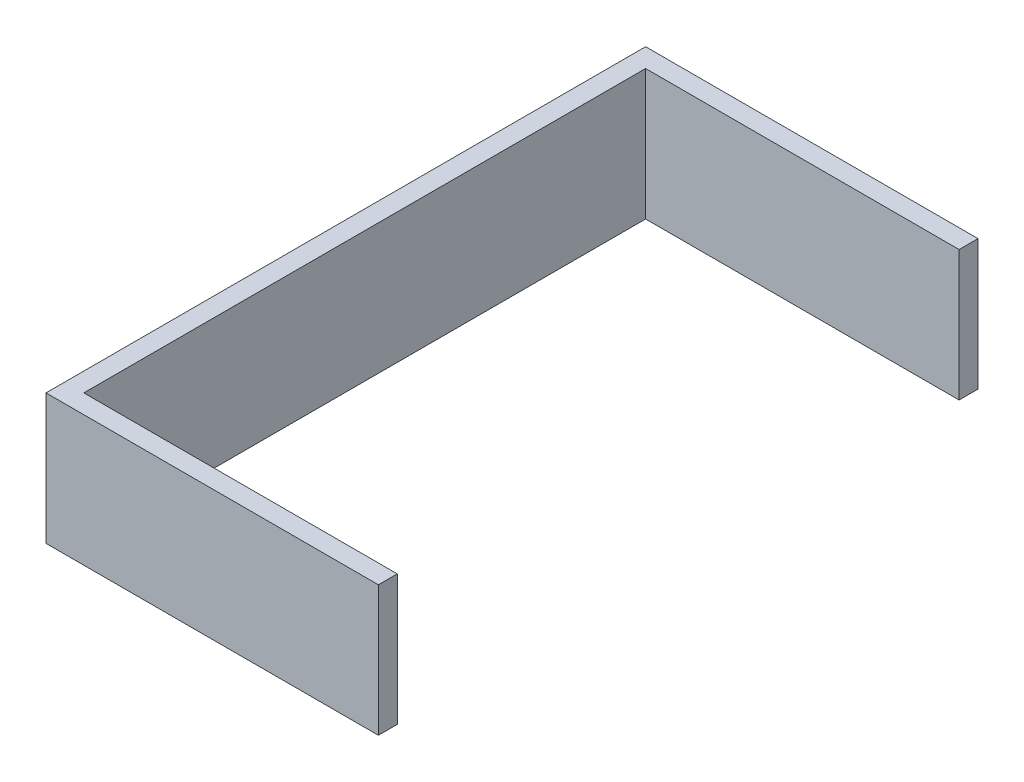
ISO-10303-21;
HEADER;
FILE_DESCRIPTION(('STEP AP214'),'2;1');
FILE_NAME('part.step','',(''),(''),'','','');
FILE_SCHEMA(('AUTOMOTIVE_DESIGN { 1 0 10303 214 1 1 1 1 }'));
ENDSEC;
DATA;
#1=APPLICATION_CONTEXT('core data for automotive mechanical design processes');
#2=APPLICATION_PROTOCOL_DEFINITION('international standard','automotive_design',2000,#1);
#3=PRODUCT_CONTEXT('',#1,'mechanical');
#4=PRODUCT('Part','Part','',(#3));
#5=PRODUCT_RELATED_PRODUCT_CATEGORY('part','',(#4));
#6=PRODUCT_DEFINITION_FORMATION('','',#4);
#7=PRODUCT_DEFINITION_CONTEXT('part definition',#1,'design');
#8=PRODUCT_DEFINITION('design','',#6,#7);
#9=PRODUCT_DEFINITION_SHAPE('','',#8);
#10=(LENGTH_UNIT() NAMED_UNIT(*) SI_UNIT(.MILLI.,.METRE.));
#11=(NAMED_UNIT(*) PLANE_ANGLE_UNIT() SI_UNIT($,.RADIAN.));
#12=(NAMED_UNIT(*) SI_UNIT($,.STERADIAN.) SOLID_ANGLE_UNIT());
#13=UNCERTAINTY_MEASURE_WITH_UNIT(LENGTH_MEASURE(1.E-05),#10,'distance_accuracy_value','');
#14=(GEOMETRIC_REPRESENTATION_CONTEXT(3) GLOBAL_UNCERTAINTY_ASSIGNED_CONTEXT((#13)) GLOBAL_UNIT_ASSIGNED_CONTEXT((#10,
#11,#12)) REPRESENTATION_CONTEXT('',''));
#15=CARTESIAN_POINT('',(0.,0.,0.));
#16=DIRECTION('',(0.,0.,1.));
#17=DIRECTION('',(1.,0.,0.));
#18=AXIS2_PLACEMENT_3D('',#15,#16,#17);
#19=CARTESIAN_POINT('',(323.85,127.,0.));
#20=DIRECTION('',(-1.,0.,0.));
#21=DIRECTION('',(0.,0.,1.));
#22=AXIS2_PLACEMENT_3D('',#19,#20,#21);
#23=PLANE('',#22);
#24=DIRECTION('',(0.,0.,-1.));
#25=VECTOR('',#24,1.);
#26=CARTESIAN_POINT('',(323.85,0.,0.));
#27=LINE('',#26,#25);
#28=CARTESIAN_POINT('',(323.85,0.,0.));
#29=VERTEX_POINT('',#28);
#30=CARTESIAN_POINT('',(323.85,0.,-18.415));
#31=VERTEX_POINT('',#30);
#32=EDGE_CURVE('E179',#29,#31,#27,.T.);
#33=ORIENTED_EDGE('',*,*,#32,.T.);
#34=DIRECTION('',(0.,-1.,0.));
#35=VECTOR('',#34,1.);
#36=CARTESIAN_POINT('',(323.85,127.,-18.415));
#37=LINE('',#36,#35);
#38=CARTESIAN_POINT('',(323.85,127.,-18.415));
#39=VERTEX_POINT('',#38);
#40=EDGE_CURVE('E75',#39,#31,#37,.T.);
#41=ORIENTED_EDGE('',*,*,#40,.F.);
#42=DIRECTION('',(0.,0.,-1.));
#43=VECTOR('',#42,1.);
#44=CARTESIAN_POINT('',(323.85,127.,0.));
#45=LINE('',#44,#43);
#46=CARTESIAN_POINT('',(323.85,127.,0.));
#47=VERTEX_POINT('',#46);
#48=EDGE_CURVE('E191',#47,#39,#45,.T.);
#49=ORIENTED_EDGE('',*,*,#48,.F.);
#50=DIRECTION('',(0.,-1.,0.));
#51=VECTOR('',#50,1.);
#52=CARTESIAN_POINT('',(323.85,127.,0.));
#53=LINE('',#52,#51);
#54=EDGE_CURVE('E12',#47,#29,#53,.T.);
#55=ORIENTED_EDGE('',*,*,#54,.T.);
#56=EDGE_LOOP('',(#33,#41,#49,#55));
#57=FACE_BOUND('',#56,.T.);
#58=ADVANCED_FACE('F65',(#57),#23,.F.);
#59=CARTESIAN_POINT('',(0.,127.,-18.415));
#60=DIRECTION('',(0.,0.,-1.));
#61=DIRECTION('',(-1.,0.,0.));
#62=AXIS2_PLACEMENT_3D('',#59,#60,#61);
#63=PLANE('',#62);
#64=DIRECTION('',(1.,0.,0.));
#65=VECTOR('',#64,1.);
#66=CARTESIAN_POINT('',(0.,0.,-18.415));
#67=LINE('',#66,#65);
#68=CARTESIAN_POINT('',(0.,0.,-18.415));
#69=VERTEX_POINT('',#68);
#70=EDGE_CURVE('E176',#69,#31,#67,.T.);
#71=ORIENTED_EDGE('',*,*,#70,.F.);
#72=DIRECTION('',(0.,-1.,0.));
#73=VECTOR('',#72,1.);
#74=CARTESIAN_POINT('',(0.,127.,-18.415));
#75=LINE('',#74,#73);
#76=CARTESIAN_POINT('',(0.,127.,-18.415));
#77=VERTEX_POINT('',#76);
#78=EDGE_CURVE('E168',#77,#69,#75,.T.);
#79=ORIENTED_EDGE('',*,*,#78,.F.);
#80=DIRECTION('',(1.,0.,0.));
#81=VECTOR('',#80,1.);
#82=CARTESIAN_POINT('',(0.,127.,-18.415));
#83=LINE('',#82,#81);
#84=EDGE_CURVE('E188',#77,#39,#83,.T.);
#85=ORIENTED_EDGE('',*,*,#84,.T.);
#86=ORIENTED_EDGE('',*,*,#40,.T.);
#87=EDGE_LOOP('',(#71,#79,#85,#86));
#88=FACE_BOUND('',#87,.T.);
#89=ADVANCED_FACE('F213',(#88),#63,.T.);
#90=CARTESIAN_POINT('',(0.,127.,0.));
#91=DIRECTION('',(0.,1.,0.));
#92=DIRECTION('',(0.,0.,1.));
#93=AXIS2_PLACEMENT_3D('',#90,#91,#92);
#94=PLANE('',#93);
#95=DIRECTION('',(1.,0.,0.));
#96=VECTOR('',#95,1.);
#97=CARTESIAN_POINT('',(0.,127.,0.));
#98=LINE('',#97,#96);
#99=CARTESIAN_POINT('',(18.415,127.,0.));
#100=VERTEX_POINT('',#99);
#101=EDGE_CURVE('E194',#100,#47,#98,.T.);
#102=ORIENTED_EDGE('',*,*,#101,.T.);
#103=ORIENTED_EDGE('',*,*,#48,.T.);
#104=ORIENTED_EDGE('',*,*,#84,.F.);
#105=DIRECTION('',(0.,0.,-1.));
#106=VECTOR('',#105,1.);
#107=CARTESIAN_POINT('',(0.,127.,0.));
#108=LINE('',#107,#106);
#109=CARTESIAN_POINT('',(0.,127.,565.785));
#110=VERTEX_POINT('',#109);
#111=EDGE_CURVE('E185',#110,#77,#108,.T.);
#112=ORIENTED_EDGE('',*,*,#111,.F.);
#113=DIRECTION('',(1.,0.,0.));
#114=VECTOR('',#113,1.);
#115=CARTESIAN_POINT('',(0.,127.,565.785));
#116=LINE('',#115,#114);
#117=CARTESIAN_POINT('',(323.85,127.,565.785));
#118=VERTEX_POINT('',#117);
#119=EDGE_CURVE('E138',#110,#118,#116,.T.);
#120=ORIENTED_EDGE('',*,*,#119,.T.);
#121=DIRECTION('',(0.,0.,1.));
#122=VECTOR('',#121,1.);
#123=CARTESIAN_POINT('',(323.85,127.,547.37));
#124=LINE('',#123,#122);
#125=CARTESIAN_POINT('',(323.85,127.,547.37));
#126=VERTEX_POINT('',#125);
#127=EDGE_CURVE('E159',#126,#118,#124,.T.);
#128=ORIENTED_EDGE('',*,*,#127,.F.);
#129=DIRECTION('',(1.,0.,0.));
#130=VECTOR('',#129,1.);
#131=CARTESIAN_POINT('',(0.,127.,547.37));
#132=LINE('',#131,#130);
#133=CARTESIAN_POINT('',(18.4150000000001,127.,547.37));
#134=VERTEX_POINT('',#133);
#135=EDGE_CURVE('E144',#134,#126,#132,.T.);
#136=ORIENTED_EDGE('',*,*,#135,.F.);
#137=DIRECTION('',(0.,0.,1.));
#138=VECTOR('',#137,1.);
#139=CARTESIAN_POINT('',(18.415,127.,0.));
#140=LINE('',#139,#138);
#141=EDGE_CURVE('E172',#100,#134,#140,.T.);
#142=ORIENTED_EDGE('',*,*,#141,.F.);
#143=EDGE_LOOP('',(#102,#103,#104,#112,#120,#128,#136,#142));
#144=FACE_BOUND('',#143,.T.);
#145=ADVANCED_FACE('F202',(#144),#94,.T.);
#146=CARTESIAN_POINT('',(0.,127.,0.));
#147=DIRECTION('',(0.,0.,-1.));
#148=DIRECTION('',(-1.,0.,0.));
#149=AXIS2_PLACEMENT_3D('',#146,#147,#148);
#150=PLANE('',#149);
#151=DIRECTION('',(1.,0.,0.));
#152=VECTOR('',#151,1.);
#153=CARTESIAN_POINT('',(0.,0.,0.));
#154=LINE('',#153,#152);
#155=CARTESIAN_POINT('',(18.415,0.,0.));
#156=VERTEX_POINT('',#155);
#157=EDGE_CURVE('E182',#156,#29,#154,.T.);
#158=ORIENTED_EDGE('',*,*,#157,.T.);
#159=ORIENTED_EDGE('',*,*,#54,.F.);
#160=ORIENTED_EDGE('',*,*,#101,.F.);
#161=DIRECTION('',(0.,-1.,0.));
#162=VECTOR('',#161,1.);
#163=CARTESIAN_POINT('',(18.415,127.,0.));
#164=LINE('',#163,#162);
#165=EDGE_CURVE('E84',#100,#156,#164,.T.);
#166=ORIENTED_EDGE('',*,*,#165,.T.);
#167=EDGE_LOOP('',(#158,#159,#160,#166));
#168=FACE_BOUND('',#167,.T.);
#169=ADVANCED_FACE('F219',(#168),#150,.F.);
#170=CARTESIAN_POINT('',(0.,0.,0.));
#171=DIRECTION('',(0.,1.,0.));
#172=DIRECTION('',(0.,0.,1.));
#173=AXIS2_PLACEMENT_3D('',#170,#171,#172);
#174=PLANE('',#173);
#175=ORIENTED_EDGE('',*,*,#157,.F.);
#176=DIRECTION('',(0.,0.,1.));
#177=VECTOR('',#176,1.);
#178=CARTESIAN_POINT('',(18.415,0.,0.));
#179=LINE('',#178,#177);
#180=CARTESIAN_POINT('',(18.4150000000001,0.,547.37));
#181=VERTEX_POINT('',#180);
#182=EDGE_CURVE('E136',#156,#181,#179,.T.);
#183=ORIENTED_EDGE('',*,*,#182,.T.);
#184=DIRECTION('',(1.,0.,0.));
#185=VECTOR('',#184,1.);
#186=CARTESIAN_POINT('',(0.,0.,547.37));
#187=LINE('',#186,#185);
#188=CARTESIAN_POINT('',(323.85,0.,547.37));
#189=VERTEX_POINT('',#188);
#190=EDGE_CURVE('E130',#181,#189,#187,.T.);
#191=ORIENTED_EDGE('',*,*,#190,.T.);
#192=DIRECTION('',(0.,0.,1.));
#193=VECTOR('',#192,1.);
#194=CARTESIAN_POINT('',(323.85,0.,547.37));
#195=LINE('',#194,#193);
#196=CARTESIAN_POINT('',(323.85,0.,565.785));
#197=VERTEX_POINT('',#196);
#198=EDGE_CURVE('E135',#189,#197,#195,.T.);
#199=ORIENTED_EDGE('',*,*,#198,.T.);
#200=DIRECTION('',(1.,0.,0.));
#201=VECTOR('',#200,1.);
#202=CARTESIAN_POINT('',(0.,0.,565.785));
#203=LINE('',#202,#201);
#204=CARTESIAN_POINT('',(0.,0.,565.785));
#205=VERTEX_POINT('',#204);
#206=EDGE_CURVE('E148',#205,#197,#203,.T.);
#207=ORIENTED_EDGE('',*,*,#206,.F.);
#208=DIRECTION('',(0.,0.,-1.));
#209=VECTOR('',#208,1.);
#210=CARTESIAN_POINT('',(0.,0.,0.));
#211=LINE('',#210,#209);
#212=EDGE_CURVE('E173',#205,#69,#211,.T.);
#213=ORIENTED_EDGE('',*,*,#212,.T.);
#214=ORIENTED_EDGE('',*,*,#70,.T.);
#215=ORIENTED_EDGE('',*,*,#32,.F.);
#216=EDGE_LOOP('',(#175,#183,#191,#199,#207,#213,#214,#215));
#217=FACE_BOUND('',#216,.T.);
#218=ADVANCED_FACE('F133',(#217),#174,.F.);
#219=CARTESIAN_POINT('',(18.415,127.,0.));
#220=DIRECTION('',(1.,0.,0.));
#221=DIRECTION('',(0.,0.,-1.));
#222=AXIS2_PLACEMENT_3D('',#219,#220,#221);
#223=PLANE('',#222);
#224=ORIENTED_EDGE('',*,*,#182,.F.);
#225=ORIENTED_EDGE('',*,*,#165,.F.);
#226=ORIENTED_EDGE('',*,*,#141,.T.);
#227=DIRECTION('',(0.,-1.,0.));
#228=VECTOR('',#227,1.);
#229=CARTESIAN_POINT('',(18.4150000000001,127.,547.37));
#230=LINE('',#229,#228);
#231=EDGE_CURVE('E160',#134,#181,#230,.T.);
#232=ORIENTED_EDGE('',*,*,#231,.T.);
#233=EDGE_LOOP('',(#224,#225,#226,#232));
#234=FACE_BOUND('',#233,.T.);
#235=ADVANCED_FACE('F201',(#234),#223,.T.);
#236=CARTESIAN_POINT('',(0.,127.,0.));
#237=DIRECTION('',(-1.,0.,0.));
#238=DIRECTION('',(0.,0.,1.));
#239=AXIS2_PLACEMENT_3D('',#236,#237,#238);
#240=PLANE('',#239);
#241=ORIENTED_EDGE('',*,*,#212,.F.);
#242=DIRECTION('',(0.,-1.,0.));
#243=VECTOR('',#242,1.);
#244=CARTESIAN_POINT('',(0.,127.,565.785));
#245=LINE('',#244,#243);
#246=EDGE_CURVE('E157',#110,#205,#245,.T.);
#247=ORIENTED_EDGE('',*,*,#246,.F.);
#248=ORIENTED_EDGE('',*,*,#111,.T.);
#249=ORIENTED_EDGE('',*,*,#78,.T.);
#250=EDGE_LOOP('',(#241,#247,#248,#249));
#251=FACE_BOUND('',#250,.T.);
#252=ADVANCED_FACE('F209',(#251),#240,.T.);
#253=CARTESIAN_POINT('',(0.,127.,565.785));
#254=DIRECTION('',(0.,0.,-1.));
#255=DIRECTION('',(-1.,0.,0.));
#256=AXIS2_PLACEMENT_3D('',#253,#254,#255);
#257=PLANE('',#256);
#258=ORIENTED_EDGE('',*,*,#206,.T.);
#259=DIRECTION('',(0.,-1.,0.));
#260=VECTOR('',#259,1.);
#261=CARTESIAN_POINT('',(323.85,127.,565.785));
#262=LINE('',#261,#260);
#263=EDGE_CURVE('E123',#118,#197,#262,.T.);
#264=ORIENTED_EDGE('',*,*,#263,.F.);
#265=ORIENTED_EDGE('',*,*,#119,.F.);
#266=ORIENTED_EDGE('',*,*,#246,.T.);
#267=EDGE_LOOP('',(#258,#264,#265,#266));
#268=FACE_BOUND('',#267,.T.);
#269=ADVANCED_FACE('F67',(#268),#257,.F.);
#270=CARTESIAN_POINT('',(323.85,127.,547.37));
#271=DIRECTION('',(1.,0.,0.));
#272=DIRECTION('',(0.,0.,-1.));
#273=AXIS2_PLACEMENT_3D('',#270,#271,#272);
#274=PLANE('',#273);
#275=ORIENTED_EDGE('',*,*,#198,.F.);
#276=DIRECTION('',(0.,-1.,0.));
#277=VECTOR('',#276,1.);
#278=CARTESIAN_POINT('',(323.85,127.,547.37));
#279=LINE('',#278,#277);
#280=EDGE_CURVE('E141',#126,#189,#279,.T.);
#281=ORIENTED_EDGE('',*,*,#280,.F.);
#282=ORIENTED_EDGE('',*,*,#127,.T.);
#283=ORIENTED_EDGE('',*,*,#263,.T.);
#284=EDGE_LOOP('',(#275,#281,#282,#283));
#285=FACE_BOUND('',#284,.T.);
#286=ADVANCED_FACE('F147',(#285),#274,.T.);
#287=CARTESIAN_POINT('',(0.,127.,547.37));
#288=DIRECTION('',(0.,0.,-1.));
#289=DIRECTION('',(-1.,0.,0.));
#290=AXIS2_PLACEMENT_3D('',#287,#288,#289);
#291=PLANE('',#290);
#292=ORIENTED_EDGE('',*,*,#231,.F.);
#293=ORIENTED_EDGE('',*,*,#135,.T.);
#294=ORIENTED_EDGE('',*,*,#280,.T.);
#295=ORIENTED_EDGE('',*,*,#190,.F.);
#296=EDGE_LOOP('',(#292,#293,#294,#295));
#297=FACE_BOUND('',#296,.T.);
#298=ADVANCED_FACE('F142',(#297),#291,.T.);
#299=CLOSED_SHELL('',(#58,#89,#145,#169,#218,#235,#252,#269,#286,#298));
#300=MANIFOLD_SOLID_BREP('B2',#299);
#301=ADVANCED_BREP_SHAPE_REPRESENTATION('',(#18,#300),#14);
#302=SHAPE_DEFINITION_REPRESENTATION(#9,#301);
ENDSEC;
END-ISO-10303-21;
